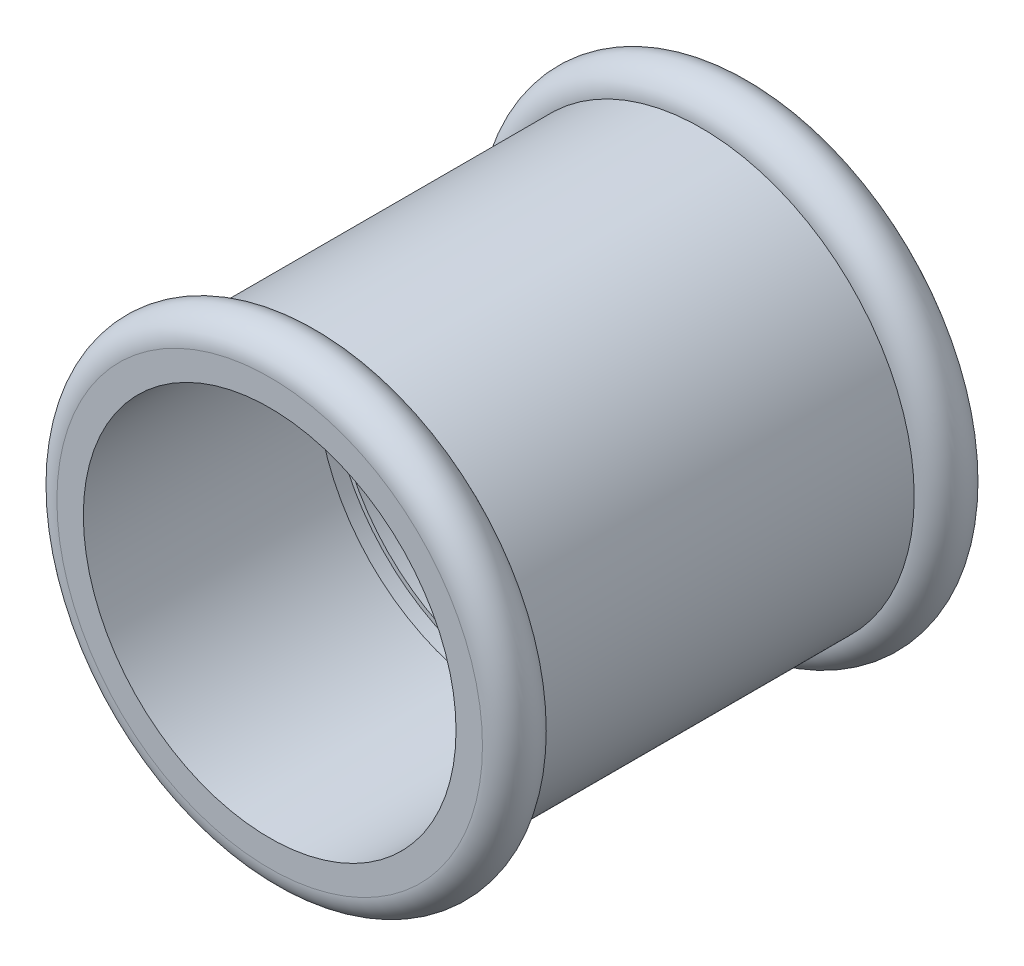
ISO-10303-21;
HEADER;
FILE_DESCRIPTION(('STEP AP214'),'2;1');
FILE_NAME('part.step','',(''),(''),'','','');
FILE_SCHEMA(('AUTOMOTIVE_DESIGN { 1 0 10303 214 1 1 1 1 }'));
ENDSEC;
DATA;
#1=APPLICATION_CONTEXT('core data for automotive mechanical design processes');
#2=APPLICATION_PROTOCOL_DEFINITION('international standard','automotive_design',2000,#1);
#3=PRODUCT_CONTEXT('',#1,'mechanical');
#4=PRODUCT('Part','Part','',(#3));
#5=PRODUCT_RELATED_PRODUCT_CATEGORY('part','',(#4));
#6=PRODUCT_DEFINITION_FORMATION('','',#4);
#7=PRODUCT_DEFINITION_CONTEXT('part definition',#1,'design');
#8=PRODUCT_DEFINITION('design','',#6,#7);
#9=PRODUCT_DEFINITION_SHAPE('','',#8);
#10=(LENGTH_UNIT() NAMED_UNIT(*) SI_UNIT(.MILLI.,.METRE.));
#11=(NAMED_UNIT(*) PLANE_ANGLE_UNIT() SI_UNIT($,.RADIAN.));
#12=(NAMED_UNIT(*) SI_UNIT($,.STERADIAN.) SOLID_ANGLE_UNIT());
#13=UNCERTAINTY_MEASURE_WITH_UNIT(LENGTH_MEASURE(1.E-05),#10,'distance_accuracy_value','');
#14=(GEOMETRIC_REPRESENTATION_CONTEXT(3) GLOBAL_UNCERTAINTY_ASSIGNED_CONTEXT((#13)) GLOBAL_UNIT_ASSIGNED_CONTEXT((#10,
#11,#12)) REPRESENTATION_CONTEXT('',''));
#15=CARTESIAN_POINT('',(0.,0.,0.));
#16=DIRECTION('',(0.,0.,1.));
#17=DIRECTION('',(1.,0.,0.));
#18=AXIS2_PLACEMENT_3D('',#15,#16,#17);
#19=CARTESIAN_POINT('',(0.,0.,47.4281327234003));
#20=DIRECTION('',(0.,0.,1.));
#21=DIRECTION('',(1.,0.,0.));
#22=AXIS2_PLACEMENT_3D('',#19,#20,#21);
#23=CYLINDRICAL_SURFACE('',#22,24.15);
#24=CARTESIAN_POINT('',(0.,0.,6.00000000000023));
#25=DIRECTION('',(0.,0.,1.));
#26=DIRECTION('',(1.,0.,0.));
#27=AXIS2_PLACEMENT_3D('',#24,#25,#26);
#28=CIRCLE('',#27,24.15);
#29=CARTESIAN_POINT('',(24.15,0.,6.00000000000023));
#30=VERTEX_POINT('',#29);
#31=EDGE_CURVE('E60',#30,#30,#28,.T.);
#32=ORIENTED_EDGE('',*,*,#31,.T.);
#33=EDGE_LOOP('',(#32));
#34=FACE_BOUND('',#33,.T.);
#35=CARTESIAN_POINT('',(0.,0.,0.));
#36=DIRECTION('',(0.,0.,1.));
#37=DIRECTION('',(1.,0.,0.));
#38=AXIS2_PLACEMENT_3D('',#35,#36,#37);
#39=CIRCLE('',#38,24.15);
#40=CARTESIAN_POINT('',(24.15,0.,0.));
#41=VERTEX_POINT('',#40);
#42=EDGE_CURVE('E12',#41,#41,#39,.T.);
#43=ORIENTED_EDGE('',*,*,#42,.F.);
#44=EDGE_LOOP('',(#43));
#45=FACE_BOUND('',#44,.T.);
#46=ADVANCED_FACE('F54',(#34,#45),#23,.F.);
#47=CARTESIAN_POINT('',(0.,0.,3.00000000000011));
#48=DIRECTION('',(0.,0.,1.));
#49=DIRECTION('',(1.,0.,0.));
#50=AXIS2_PLACEMENT_3D('',#47,#48,#49);
#51=TOROIDAL_SURFACE('',#50,24.15,3.);
#52=ORIENTED_EDGE('',*,*,#31,.F.);
#53=EDGE_LOOP('',(#52));
#54=FACE_BOUND('',#53,.T.);
#55=ORIENTED_EDGE('',*,*,#42,.T.);
#56=EDGE_LOOP('',(#55));
#57=FACE_BOUND('',#56,.T.);
#58=ADVANCED_FACE('F88',(#54,#57),#51,.T.);
#59=CLOSED_SHELL('',(#46,#58));
#60=CARTESIAN_POINT('',(0.,0.,47.4281327234003));
#61=DIRECTION('',(0.,0.,1.));
#62=DIRECTION('',(1.,0.,0.));
#63=AXIS2_PLACEMENT_3D('',#60,#61,#62);
#64=CYLINDRICAL_SURFACE('',#63,25.15);
#65=CARTESIAN_POINT('',(0.,0.,4.73205080756856));
#66=DIRECTION('',(0.,0.,1.));
#67=DIRECTION('',(1.,0.,0.));
#68=AXIS2_PLACEMENT_3D('',#65,#66,#67);
#69=CIRCLE('',#68,25.15);
#70=CARTESIAN_POINT('',(25.15,0.,4.73205080756856));
#71=VERTEX_POINT('',#70);
#72=EDGE_CURVE('E68',#71,#71,#69,.T.);
#73=ORIENTED_EDGE('',*,*,#72,.F.);
#74=EDGE_LOOP('',(#73));
#75=FACE_BOUND('',#74,.T.);
#76=CARTESIAN_POINT('',(0.,0.,1.26794919243167));
#77=DIRECTION('',(0.,0.,1.));
#78=DIRECTION('',(1.,0.,0.));
#79=AXIS2_PLACEMENT_3D('',#76,#77,#78);
#80=CIRCLE('',#79,25.15);
#81=CARTESIAN_POINT('',(25.15,0.,1.26794919243167));
#82=VERTEX_POINT('',#81);
#83=EDGE_CURVE('E64',#82,#82,#80,.T.);
#84=ORIENTED_EDGE('',*,*,#83,.T.);
#85=EDGE_LOOP('',(#84));
#86=FACE_BOUND('',#85,.T.);
#87=ADVANCED_FACE('F77',(#75,#86),#64,.T.);
#88=CARTESIAN_POINT('',(0.,0.,3.00000000000011));
#89=DIRECTION('',(0.,0.,1.));
#90=DIRECTION('',(1.,0.,0.));
#91=AXIS2_PLACEMENT_3D('',#88,#89,#90);
#92=TOROIDAL_SURFACE('',#91,24.15,2.);
#93=ORIENTED_EDGE('',*,*,#72,.T.);
#94=EDGE_LOOP('',(#93));
#95=FACE_BOUND('',#94,.T.);
#96=ORIENTED_EDGE('',*,*,#83,.F.);
#97=EDGE_LOOP('',(#96));
#98=FACE_BOUND('',#97,.T.);
#99=ADVANCED_FACE('F74',(#95,#98),#92,.F.);
#100=CLOSED_SHELL('',(#87,#99));
#101=ORIENTED_CLOSED_SHELL('',*,#100,.T.);
#102=BREP_WITH_VOIDS('B2',#59,(#101));
#103=CARTESIAN_POINT('',(0.,0.,51.9999999999996));
#104=DIRECTION('',(0.,0.,1.));
#105=DIRECTION('',(1.,0.,0.));
#106=AXIS2_PLACEMENT_3D('',#103,#104,#105);
#107=TOROIDAL_SURFACE('',#106,24.15,3.);
#108=CARTESIAN_POINT('',(0.,0.,48.9999999999995));
#109=DIRECTION('',(0.,0.,1.));
#110=DIRECTION('',(1.,0.,0.));
#111=AXIS2_PLACEMENT_3D('',#108,#109,#110);
#112=CIRCLE('',#111,24.15);
#113=CARTESIAN_POINT('',(24.15,0.,48.9999999999995));
#114=VERTEX_POINT('',#113);
#115=EDGE_CURVE('E131',#114,#114,#112,.T.);
#116=ORIENTED_EDGE('',*,*,#115,.T.);
#117=EDGE_LOOP('',(#116));
#118=FACE_BOUND('',#117,.T.);
#119=CARTESIAN_POINT('',(0.,0.,54.9999999999997));
#120=DIRECTION('',(0.,0.,1.));
#121=DIRECTION('',(1.,0.,0.));
#122=AXIS2_PLACEMENT_3D('',#119,#120,#121);
#123=CIRCLE('',#122,24.15);
#124=CARTESIAN_POINT('',(24.15,0.,54.9999999999997));
#125=VERTEX_POINT('',#124);
#126=EDGE_CURVE('E52',#125,#125,#123,.T.);
#127=ORIENTED_EDGE('',*,*,#126,.F.);
#128=EDGE_LOOP('',(#127));
#129=FACE_BOUND('',#128,.T.);
#130=ADVANCED_FACE('F125',(#118,#129),#107,.T.);
#131=CARTESIAN_POINT('',(0.,0.,47.4281327234003));
#132=DIRECTION('',(0.,0.,1.));
#133=DIRECTION('',(1.,0.,0.));
#134=AXIS2_PLACEMENT_3D('',#131,#132,#133);
#135=CYLINDRICAL_SURFACE('',#134,24.15);
#136=ORIENTED_EDGE('',*,*,#115,.F.);
#137=EDGE_LOOP('',(#136));
#138=FACE_BOUND('',#137,.T.);
#139=ORIENTED_EDGE('',*,*,#126,.T.);
#140=EDGE_LOOP('',(#139));
#141=FACE_BOUND('',#140,.T.);
#142=ADVANCED_FACE('F159',(#138,#141),#135,.F.);
#143=CLOSED_SHELL('',(#130,#142));
#144=CARTESIAN_POINT('',(0.,0.,51.9999999999996));
#145=DIRECTION('',(0.,0.,1.));
#146=DIRECTION('',(1.,0.,0.));
#147=AXIS2_PLACEMENT_3D('',#144,#145,#146);
#148=TOROIDAL_SURFACE('',#147,24.15,2.);
#149=CARTESIAN_POINT('',(0.,0.,50.2679491924312));
#150=DIRECTION('',(0.,0.,1.));
#151=DIRECTION('',(1.,0.,0.));
#152=AXIS2_PLACEMENT_3D('',#149,#150,#151);
#153=CIRCLE('',#152,25.15);
#154=CARTESIAN_POINT('',(25.15,0.,50.2679491924312));
#155=VERTEX_POINT('',#154);
#156=EDGE_CURVE('E139',#155,#155,#153,.T.);
#157=ORIENTED_EDGE('',*,*,#156,.F.);
#158=EDGE_LOOP('',(#157));
#159=FACE_BOUND('',#158,.T.);
#160=CARTESIAN_POINT('',(0.,0.,53.732050807568));
#161=DIRECTION('',(0.,0.,1.));
#162=DIRECTION('',(1.,0.,0.));
#163=AXIS2_PLACEMENT_3D('',#160,#161,#162);
#164=CIRCLE('',#163,25.15);
#165=CARTESIAN_POINT('',(25.15,0.,53.732050807568));
#166=VERTEX_POINT('',#165);
#167=EDGE_CURVE('E135',#166,#166,#164,.T.);
#168=ORIENTED_EDGE('',*,*,#167,.T.);
#169=EDGE_LOOP('',(#168));
#170=FACE_BOUND('',#169,.T.);
#171=ADVANCED_FACE('F148',(#159,#170),#148,.F.);
#172=CARTESIAN_POINT('',(0.,0.,47.4281327234003));
#173=DIRECTION('',(0.,0.,1.));
#174=DIRECTION('',(1.,0.,0.));
#175=AXIS2_PLACEMENT_3D('',#172,#173,#174);
#176=CYLINDRICAL_SURFACE('',#175,25.15);
#177=ORIENTED_EDGE('',*,*,#156,.T.);
#178=EDGE_LOOP('',(#177));
#179=FACE_BOUND('',#178,.T.);
#180=ORIENTED_EDGE('',*,*,#167,.F.);
#181=EDGE_LOOP('',(#180));
#182=FACE_BOUND('',#181,.T.);
#183=ADVANCED_FACE('F145',(#179,#182),#176,.T.);
#184=CLOSED_SHELL('',(#171,#183));
#185=ORIENTED_CLOSED_SHELL('',*,#184,.T.);
#186=BREP_WITH_VOIDS('B7',#143,(#185));
#187=CARTESIAN_POINT('',(0.,0.,54.9999999999997));
#188=DIRECTION('',(0.,0.,-1.));
#189=DIRECTION('',(-1.,0.,0.));
#190=AXIS2_PLACEMENT_3D('',#187,#188,#189);
#191=CYLINDRICAL_SURFACE('',#190,21.15);
#192=CARTESIAN_POINT('',(0.,0.,54.9999999999997));
#193=DIRECTION('',(0.,0.,1.));
#194=DIRECTION('',(1.,0.,0.));
#195=AXIS2_PLACEMENT_3D('',#192,#193,#194);
#196=CIRCLE('',#195,21.15);
#197=CARTESIAN_POINT('',(21.15,0.,54.9999999999997));
#198=VERTEX_POINT('',#197);
#199=EDGE_CURVE('E201',#198,#198,#196,.T.);
#200=ORIENTED_EDGE('',*,*,#199,.T.);
#201=EDGE_LOOP('',(#200));
#202=FACE_BOUND('',#201,.T.);
#203=CARTESIAN_POINT('',(0.,0.,28.5000000000011));
#204=DIRECTION('',(0.,0.,-1.));
#205=DIRECTION('',(-1.,0.,0.));
#206=AXIS2_PLACEMENT_3D('',#203,#204,#205);
#207=CIRCLE('',#206,21.15);
#208=CARTESIAN_POINT('',(-21.15,0.,28.5000000000011));
#209=VERTEX_POINT('',#208);
#210=EDGE_CURVE('E206',#209,#209,#207,.T.);
#211=ORIENTED_EDGE('',*,*,#210,.T.);
#212=EDGE_LOOP('',(#211));
#213=FACE_BOUND('',#212,.T.);
#214=ADVANCED_FACE('F188',(#202,#213),#191,.F.);
#215=CARTESIAN_POINT('',(0.,0.,54.9999999999997));
#216=DIRECTION('',(0.,0.,1.));
#217=DIRECTION('',(1.,0.,0.));
#218=AXIS2_PLACEMENT_3D('',#215,#216,#217);
#219=PLANE('',#218);
#220=CARTESIAN_POINT('',(0.,0.,54.9999999999997));
#221=DIRECTION('',(0.,0.,1.));
#222=DIRECTION('',(1.,0.,0.));
#223=AXIS2_PLACEMENT_3D('',#220,#221,#222);
#224=CIRCLE('',#223,24.15);
#225=CARTESIAN_POINT('',(24.15,0.,54.9999999999997));
#226=VERTEX_POINT('',#225);
#227=EDGE_CURVE('E123',#226,#226,#224,.T.);
#228=ORIENTED_EDGE('',*,*,#227,.T.);
#229=EDGE_LOOP('',(#228));
#230=FACE_BOUND('',#229,.T.);
#231=ORIENTED_EDGE('',*,*,#199,.F.);
#232=EDGE_LOOP('',(#231));
#233=FACE_BOUND('',#232,.T.);
#234=ADVANCED_FACE('F244',(#230,#233),#219,.T.);
#235=CARTESIAN_POINT('',(0.,0.,0.));
#236=DIRECTION('',(0.,0.,1.));
#237=DIRECTION('',(1.,0.,0.));
#238=AXIS2_PLACEMENT_3D('',#235,#236,#237);
#239=PLANE('',#238);
#240=CARTESIAN_POINT('',(0.,0.,0.));
#241=DIRECTION('',(0.,0.,1.));
#242=DIRECTION('',(1.,0.,0.));
#243=AXIS2_PLACEMENT_3D('',#240,#241,#242);
#244=CIRCLE('',#243,24.15);
#245=CARTESIAN_POINT('',(24.15,0.,0.));
#246=VERTEX_POINT('',#245);
#247=EDGE_CURVE('E196',#246,#246,#244,.T.);
#248=ORIENTED_EDGE('',*,*,#247,.F.);
#249=EDGE_LOOP('',(#248));
#250=FACE_BOUND('',#249,.T.);
#251=CARTESIAN_POINT('',(0.,0.,0.));
#252=DIRECTION('',(0.,0.,1.));
#253=DIRECTION('',(1.,0.,0.));
#254=AXIS2_PLACEMENT_3D('',#251,#252,#253);
#255=CIRCLE('',#254,21.15);
#256=CARTESIAN_POINT('',(21.15,0.,0.));
#257=VERTEX_POINT('',#256);
#258=EDGE_CURVE('E204',#257,#257,#255,.T.);
#259=ORIENTED_EDGE('',*,*,#258,.T.);
#260=EDGE_LOOP('',(#259));
#261=FACE_BOUND('',#260,.T.);
#262=ADVANCED_FACE('F225',(#250,#261),#239,.F.);
#263=CARTESIAN_POINT('',(0.,0.,54.9999999999997));
#264=DIRECTION('',(0.,0.,-1.));
#265=DIRECTION('',(-1.,0.,0.));
#266=AXIS2_PLACEMENT_3D('',#263,#264,#265);
#267=CYLINDRICAL_SURFACE('',#266,24.15);
#268=ORIENTED_EDGE('',*,*,#227,.F.);
#269=EDGE_LOOP('',(#268));
#270=FACE_BOUND('',#269,.T.);
#271=ORIENTED_EDGE('',*,*,#247,.T.);
#272=EDGE_LOOP('',(#271));
#273=FACE_BOUND('',#272,.T.);
#274=ADVANCED_FACE('F190',(#270,#273),#267,.T.);
#275=CARTESIAN_POINT('',(0.,0.,26.4999999999986));
#276=DIRECTION('',(0.,0.,-1.));
#277=DIRECTION('',(-1.,0.,0.));
#278=AXIS2_PLACEMENT_3D('',#275,#276,#277);
#279=CIRCLE('',#278,21.15);
#280=CARTESIAN_POINT('',(-21.15,0.,26.4999999999986));
#281=VERTEX_POINT('',#280);
#282=EDGE_CURVE('E192',#281,#281,#279,.T.);
#283=ORIENTED_EDGE('',*,*,#282,.F.);
#284=EDGE_LOOP('',(#283));
#285=FACE_BOUND('',#284,.T.);
#286=ORIENTED_EDGE('',*,*,#258,.F.);
#287=EDGE_LOOP('',(#286));
#288=FACE_BOUND('',#287,.T.);
#289=ADVANCED_FACE('F227',(#285,#288),#191,.F.);
#290=CARTESIAN_POINT('',(0.,0.,26.4999999999986));
#291=DIRECTION('',(0.,0.,-1.));
#292=DIRECTION('',(-1.,0.,0.));
#293=AXIS2_PLACEMENT_3D('',#290,#291,#292);
#294=PLANE('',#293);
#295=ORIENTED_EDGE('',*,*,#282,.T.);
#296=EDGE_LOOP('',(#295));
#297=FACE_BOUND('',#296,.T.);
#298=CARTESIAN_POINT('',(0.,0.,26.4999999999986));
#299=DIRECTION('',(0.,0.,-1.));
#300=DIRECTION('',(-1.,0.,0.));
#301=AXIS2_PLACEMENT_3D('',#298,#299,#300);
#302=CIRCLE('',#301,21.65);
#303=CARTESIAN_POINT('',(-21.65,0.,26.4999999999986));
#304=VERTEX_POINT('',#303);
#305=EDGE_CURVE('E208',#304,#304,#302,.T.);
#306=ORIENTED_EDGE('',*,*,#305,.F.);
#307=EDGE_LOOP('',(#306));
#308=FACE_BOUND('',#307,.T.);
#309=ADVANCED_FACE('F229',(#297,#308),#294,.F.);
#310=CARTESIAN_POINT('',(0.,0.,26.4999999999986));
#311=DIRECTION('',(0.,0.,1.));
#312=DIRECTION('',(1.,0.,0.));
#313=AXIS2_PLACEMENT_3D('',#310,#311,#312);
#314=CYLINDRICAL_SURFACE('',#313,21.65);
#315=ORIENTED_EDGE('',*,*,#305,.T.);
#316=EDGE_LOOP('',(#315));
#317=FACE_BOUND('',#316,.T.);
#318=CARTESIAN_POINT('',(0.,0.,28.5000000000011));
#319=DIRECTION('',(0.,0.,-1.));
#320=DIRECTION('',(-1.,0.,0.));
#321=AXIS2_PLACEMENT_3D('',#318,#319,#320);
#322=CIRCLE('',#321,21.65);
#323=CARTESIAN_POINT('',(-21.65,0.,28.5000000000011));
#324=VERTEX_POINT('',#323);
#325=EDGE_CURVE('E213',#324,#324,#322,.T.);
#326=ORIENTED_EDGE('',*,*,#325,.F.);
#327=EDGE_LOOP('',(#326));
#328=FACE_BOUND('',#327,.T.);
#329=ADVANCED_FACE('F236',(#317,#328),#314,.F.);
#330=CARTESIAN_POINT('',(0.,0.,28.5000000000011));
#331=DIRECTION('',(0.,0.,-1.));
#332=DIRECTION('',(-1.,0.,0.));
#333=AXIS2_PLACEMENT_3D('',#330,#331,#332);
#334=PLANE('',#333);
#335=ORIENTED_EDGE('',*,*,#210,.F.);
#336=EDGE_LOOP('',(#335));
#337=FACE_BOUND('',#336,.T.);
#338=ORIENTED_EDGE('',*,*,#325,.T.);
#339=EDGE_LOOP('',(#338));
#340=FACE_BOUND('',#339,.T.);
#341=ADVANCED_FACE('F281',(#337,#340),#334,.T.);
#342=CLOSED_SHELL('',(#214,#234,#262,#274,#289,#309,#329,#341));
#343=MANIFOLD_SOLID_BREP('B47',#342);
#344=ADVANCED_BREP_SHAPE_REPRESENTATION('',(#18,#102,#186,#343),#14);
#345=SHAPE_DEFINITION_REPRESENTATION(#9,#344);
ENDSEC;
END-ISO-10303-21;
